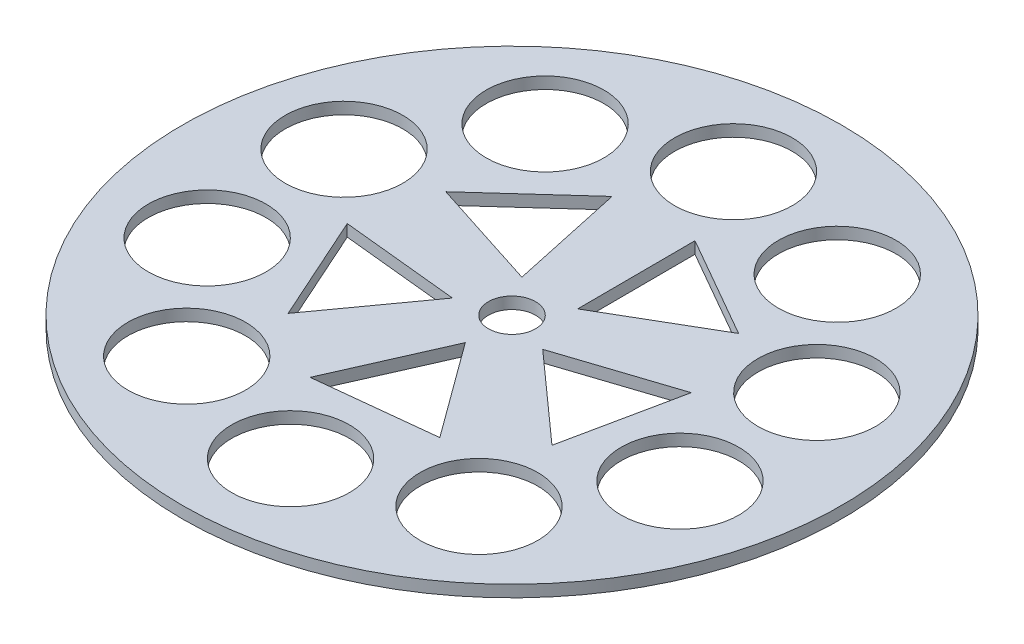
ISO-10303-21;
HEADER;
FILE_DESCRIPTION(('STEP AP214'),'2;1');
FILE_NAME('part.step','',(''),(''),'','','');
FILE_SCHEMA(('AUTOMOTIVE_DESIGN { 1 0 10303 214 1 1 1 1 }'));
ENDSEC;
DATA;
#1=APPLICATION_CONTEXT('core data for automotive mechanical design processes');
#2=APPLICATION_PROTOCOL_DEFINITION('international standard','automotive_design',2000,#1);
#3=PRODUCT_CONTEXT('',#1,'mechanical');
#4=PRODUCT('Part','Part','',(#3));
#5=PRODUCT_RELATED_PRODUCT_CATEGORY('part','',(#4));
#6=PRODUCT_DEFINITION_FORMATION('','',#4);
#7=PRODUCT_DEFINITION_CONTEXT('part definition',#1,'design');
#8=PRODUCT_DEFINITION('design','',#6,#7);
#9=PRODUCT_DEFINITION_SHAPE('','',#8);
#10=(LENGTH_UNIT() NAMED_UNIT(*) SI_UNIT(.MILLI.,.METRE.));
#11=(NAMED_UNIT(*) PLANE_ANGLE_UNIT() SI_UNIT($,.RADIAN.));
#12=(NAMED_UNIT(*) SI_UNIT($,.STERADIAN.) SOLID_ANGLE_UNIT());
#13=UNCERTAINTY_MEASURE_WITH_UNIT(LENGTH_MEASURE(1.E-05),#10,'distance_accuracy_value','');
#14=(GEOMETRIC_REPRESENTATION_CONTEXT(3) GLOBAL_UNCERTAINTY_ASSIGNED_CONTEXT((#13)) GLOBAL_UNIT_ASSIGNED_CONTEXT((#10,
#11,#12)) REPRESENTATION_CONTEXT('',''));
#15=CARTESIAN_POINT('',(0.,0.,0.));
#16=DIRECTION('',(0.,0.,1.));
#17=DIRECTION('',(1.,0.,0.));
#18=AXIS2_PLACEMENT_3D('',#15,#16,#17);
#19=CARTESIAN_POINT('',(0.,6.35,0.));
#20=DIRECTION('',(0.,1.,0.));
#21=DIRECTION('',(0.,0.,1.));
#22=AXIS2_PLACEMENT_3D('',#19,#20,#21);
#23=PLANE('',#22);
#24=CARTESIAN_POINT('',(-118.323617254643,6.35,46.135903586855));
#25=DIRECTION('',(0.,1.,0.));
#26=DIRECTION('',(0.,0.,1.));
#27=AXIS2_PLACEMENT_3D('',#24,#25,#26);
#28=CIRCLE('',#27,31.7500000000029);
#29=CARTESIAN_POINT('',(-118.323617254643,6.35,77.8859035868579));
#30=VERTEX_POINT('',#29);
#31=EDGE_CURVE('E269',#30,#30,#28,.T.);
#32=ORIENTED_EDGE('',*,*,#31,.F.);
#33=EDGE_LOOP('',(#32));
#34=FACE_BOUND('',#33,.T.);
#35=CARTESIAN_POINT('',(7.31384317384814,6.35,126.789225480825));
#36=DIRECTION('',(0.,1.,0.));
#37=DIRECTION('',(0.,0.,1.));
#38=AXIS2_PLACEMENT_3D('',#35,#36,#37);
#39=CIRCLE('',#38,31.7500000000088);
#40=CARTESIAN_POINT('',(7.31384317384814,6.35,158.539225480834));
#41=VERTEX_POINT('',#40);
#42=EDGE_CURVE('E281',#41,#41,#39,.T.);
#43=ORIENTED_EDGE('',*,*,#42,.F.);
#44=EDGE_LOOP('',(#43));
#45=FACE_BOUND('',#44,.T.);
#46=CARTESIAN_POINT('',(122.843820924473,6.35,32.2241471675647));
#47=DIRECTION('',(0.,1.,0.));
#48=DIRECTION('',(0.,0.,1.));
#49=AXIS2_PLACEMENT_3D('',#46,#47,#48);
#50=CIRCLE('',#49,31.7500000000108);
#51=CARTESIAN_POINT('',(122.843820924473,6.35,63.9741471675755));
#52=VERTEX_POINT('',#51);
#53=EDGE_CURVE('E293',#52,#52,#50,.T.);
#54=ORIENTED_EDGE('',*,*,#53,.F.);
#55=EDGE_LOOP('',(#54));
#56=FACE_BOUND('',#55,.T.);
#57=CARTESIAN_POINT('',(68.6078134653874,6.35,-106.873607272796));
#58=DIRECTION('',(0.,1.,0.));
#59=DIRECTION('',(0.,0.,1.));
#60=AXIS2_PLACEMENT_3D('',#57,#58,#59);
#61=CIRCLE('',#60,31.7500000000057);
#62=CARTESIAN_POINT('',(68.6078134653874,6.35,-75.1236072727907));
#63=VERTEX_POINT('',#62);
#64=EDGE_CURVE('E305',#63,#63,#61,.T.);
#65=ORIENTED_EDGE('',*,*,#64,.F.);
#66=EDGE_LOOP('',(#65));
#67=FACE_BOUND('',#66,.T.);
#68=CARTESIAN_POINT('',(0.,6.35,0.));
#69=DIRECTION('',(0.,1.,0.));
#70=DIRECTION('',(0.,0.,1.));
#71=AXIS2_PLACEMENT_3D('',#68,#69,#70);
#72=CIRCLE('',#71,12.7);
#73=CARTESIAN_POINT('',(0.,6.35,12.7));
#74=VERTEX_POINT('',#73);
#75=EDGE_CURVE('E317',#74,#74,#72,.T.);
#76=ORIENTED_EDGE('',*,*,#75,.F.);
#77=EDGE_LOOP('',(#76));
#78=FACE_BOUND('',#77,.T.);
#79=CARTESIAN_POINT('',(0.,6.35,0.));
#80=DIRECTION('',(0.,1.,0.));
#81=DIRECTION('',(0.,0.,1.));
#82=AXIS2_PLACEMENT_3D('',#79,#80,#81);
#83=CIRCLE('',#82,177.8);
#84=CARTESIAN_POINT('',(0.,6.35,177.8));
#85=VERTEX_POINT('',#84);
#86=EDGE_CURVE('E11',#85,#85,#83,.T.);
#87=ORIENTED_EDGE('',*,*,#86,.T.);
#88=EDGE_LOOP('',(#87));
#89=FACE_BOUND('',#88,.T.);
#90=CARTESIAN_POINT('',(-80.441860309045,6.35,-98.2756689624654));
#91=DIRECTION('',(0.,1.,0.));
#92=DIRECTION('',(0.,0.,1.));
#93=AXIS2_PLACEMENT_3D('',#90,#91,#92);
#94=CIRCLE('',#93,31.75);
#95=CARTESIAN_POINT('',(-80.441860309045,6.35,-66.5256689624654));
#96=VERTEX_POINT('',#95);
#97=EDGE_CURVE('E323',#96,#96,#94,.T.);
#98=ORIENTED_EDGE('',*,*,#97,.F.);
#99=EDGE_LOOP('',(#98));
#100=FACE_BOUND('',#99,.T.);
#101=CARTESIAN_POINT('',(-7.31384317383845,6.35,-126.789225480829));
#102=DIRECTION('',(0.,1.,0.));
#103=DIRECTION('',(0.,0.,1.));
#104=AXIS2_PLACEMENT_3D('',#101,#102,#103);
#105=CIRCLE('',#104,31.75);
#106=CARTESIAN_POINT('',(-7.31384317383845,6.35,-95.039225480829));
#107=VERTEX_POINT('',#106);
#108=EDGE_CURVE('E311',#107,#107,#105,.T.);
#109=ORIENTED_EDGE('',*,*,#108,.F.);
#110=EDGE_LOOP('',(#109));
#111=FACE_BOUND('',#110,.T.);
#112=CARTESIAN_POINT('',(118.323617254651,6.35,-46.1359035868617));
#113=DIRECTION('',(0.,1.,0.));
#114=DIRECTION('',(0.,0.,1.));
#115=AXIS2_PLACEMENT_3D('',#112,#113,#114);
#116=CIRCLE('',#115,31.7500000000089);
#117=CARTESIAN_POINT('',(118.323617254651,6.35,-14.3859035868528));
#118=VERTEX_POINT('',#117);
#119=EDGE_CURVE('E299',#118,#118,#116,.T.);
#120=ORIENTED_EDGE('',*,*,#119,.F.);
#121=EDGE_LOOP('',(#120));
#122=FACE_BOUND('',#121,.T.);
#123=CARTESIAN_POINT('',(80.4418603090533,6.35,98.2756689624587));
#124=DIRECTION('',(0.,1.,0.));
#125=DIRECTION('',(0.,0.,1.));
#126=AXIS2_PLACEMENT_3D('',#123,#124,#125);
#127=CIRCLE('',#126,31.7500000000108);
#128=CARTESIAN_POINT('',(80.4418603090533,6.35,130.025668962469));
#129=VERTEX_POINT('',#128);
#130=EDGE_CURVE('E287',#129,#129,#127,.T.);
#131=ORIENTED_EDGE('',*,*,#130,.F.);
#132=EDGE_LOOP('',(#131));
#133=FACE_BOUND('',#132,.T.);
#134=CARTESIAN_POINT('',(-68.607813465379,6.35,106.87360727279));
#135=DIRECTION('',(0.,1.,0.));
#136=DIRECTION('',(0.,0.,1.));
#137=AXIS2_PLACEMENT_3D('',#134,#135,#136);
#138=CIRCLE('',#137,31.7500000000057);
#139=CARTESIAN_POINT('',(-68.607813465379,6.35,138.623607272795));
#140=VERTEX_POINT('',#139);
#141=EDGE_CURVE('E275',#140,#140,#138,.T.);
#142=ORIENTED_EDGE('',*,*,#141,.F.);
#143=EDGE_LOOP('',(#142));
#144=FACE_BOUND('',#143,.T.);
#145=CARTESIAN_POINT('',(-122.843820924465,6.35,-32.2241471675714));
#146=DIRECTION('',(0.,1.,0.));
#147=DIRECTION('',(0.,0.,1.));
#148=AXIS2_PLACEMENT_3D('',#145,#146,#147);
#149=CIRCLE('',#148,31.7500000000013);
#150=CARTESIAN_POINT('',(-122.843820924465,6.35,-0.474147167570056));
#151=VERTEX_POINT('',#150);
#152=EDGE_CURVE('E263',#151,#151,#149,.T.);
#153=ORIENTED_EDGE('',*,*,#152,.F.);
#154=EDGE_LOOP('',(#153));
#155=FACE_BOUND('',#154,.T.);
#156=DIRECTION('',(0.00335438666040697,0.,0.999994374029241));
#157=VECTOR('',#156,1.);
#158=CARTESIAN_POINT('',(14.5502550947402,6.35,-84.1686096844464));
#159=LINE('',#158,#157);
#160=CARTESIAN_POINT('',(14.5502550947402,6.35,-84.1686096844464));
#161=VERTEX_POINT('',#160);
#162=CARTESIAN_POINT('',(14.7632586476761,6.35,-20.6689669335895));
#163=VERTEX_POINT('',#162);
#164=EDGE_CURVE('E241',#161,#163,#159,.T.);
#165=ORIENTED_EDGE('',*,*,#164,.F.);
#166=DIRECTION('',(-0.867697724881044,0.,-0.497092202952592));
#167=VECTOR('',#166,1.);
#168=CARTESIAN_POINT('',(69.6490606246866,6.35,-52.6032547969568));
#169=LINE('',#168,#167);
#170=CARTESIAN_POINT('',(69.6490606246866,6.35,-52.6032547969568));
#171=VERTEX_POINT('',#170);
#172=EDGE_CURVE('E239',#171,#161,#169,.T.);
#173=ORIENTED_EDGE('',*,*,#172,.F.);
#174=DIRECTION('',(0.864343338220637,0.,-0.502902171076648));
#175=VECTOR('',#174,1.);
#176=CARTESIAN_POINT('',(14.7632586476761,6.35,-20.6689669335895));
#177=LINE('',#176,#175);
#178=EDGE_CURVE('E245',#163,#171,#177,.T.);
#179=ORIENTED_EDGE('',*,*,#178,.F.);
#180=EDGE_LOOP('',(#165,#173,#179));
#181=FACE_BOUND('',#180,.T.);
#182=DIRECTION('',(-0.950014603195232,0.,0.312205467145927));
#183=VECTOR('',#182,1.);
#184=CARTESIAN_POINT('',(84.5453808046649,6.35,-12.1714158637978));
#185=LINE('',#184,#183);
#186=CARTESIAN_POINT('',(84.5453808046649,6.35,-12.1714158637978));
#187=VERTEX_POINT('',#186);
#188=CARTESIAN_POINT('',(24.2194535017676,6.35,7.65363129996857));
#189=VERTEX_POINT('',#188);
#190=EDGE_CURVE('E217',#187,#189,#185,.T.);
#191=ORIENTED_EDGE('',*,*,#190,.F.);
#192=DIRECTION('',(0.204629435848855,0.,-0.978839513906227));
#193=VECTOR('',#192,1.);
#194=CARTESIAN_POINT('',(71.5514116282625,6.35,49.9848932692477));
#195=LINE('',#194,#193);
#196=CARTESIAN_POINT('',(71.5514116282625,6.35,49.9848932692477));
#197=VERTEX_POINT('',#196);
#198=EDGE_CURVE('E215',#197,#187,#195,.T.);
#199=ORIENTED_EDGE('',*,*,#198,.F.);
#200=DIRECTION('',(0.745385167346376,0.,0.666634046760301));
#201=VECTOR('',#200,1.);
#202=CARTESIAN_POINT('',(24.2194535017676,6.35,7.65363129996857));
#203=LINE('',#202,#201);
#204=EDGE_CURVE('E221',#189,#197,#203,.T.);
#205=ORIENTED_EDGE('',*,*,#204,.F.);
#206=EDGE_LOOP('',(#191,#199,#205));
#207=FACE_BOUND('',#206,.T.);
#208=DIRECTION('',(-0.590495701243805,0.,-0.807040783859519));
#209=VECTOR('',#208,1.);
#210=CARTESIAN_POINT('',(37.7016638343494,6.35,76.6462609894119));
#211=LINE('',#210,#209);
#212=CARTESIAN_POINT('',(37.7016638343494,6.35,76.6462609894119));
#213=VERTEX_POINT('',#212);
#214=CARTESIAN_POINT('',(0.205186805367743,6.35,25.3991712143323));
#215=VERTEX_POINT('',#214);
#216=EDGE_CURVE('E193',#213,#215,#211,.T.);
#217=ORIENTED_EDGE('',*,*,#216,.F.);
#218=DIRECTION('',(0.994165671334353,0.,-0.107863886172882));
#219=VECTOR('',#218,1.);
#220=CARTESIAN_POINT('',(-25.4278562953821,6.35,83.4956177613899));
#221=LINE('',#220,#219);
#222=CARTESIAN_POINT('',(-25.4278562953821,6.35,83.4956177613899));
#223=VERTEX_POINT('',#222);
#224=EDGE_CURVE('E191',#223,#213,#221,.T.);
#225=ORIENTED_EDGE('',*,*,#224,.F.);
#226=DIRECTION('',(-0.403669970090548,0.,0.914904670032401));
#227=VECTOR('',#226,1.);
#228=CARTESIAN_POINT('',(0.205186805367741,6.35,25.3991712143323));
#229=LINE('',#228,#227);
#230=EDGE_CURVE('E197',#215,#223,#229,.T.);
#231=ORIENTED_EDGE('',*,*,#230,.F.);
#232=EDGE_LOOP('',(#217,#225,#231));
#233=FACE_BOUND('',#232,.T.);
#234=DIRECTION('',(0.585068189615857,0.,-0.810984101878467));
#235=VECTOR('',#234,1.);
#236=CARTESIAN_POINT('',(-61.2444711226105,6.35,59.5414102658517));
#237=LINE('',#236,#235);
#238=CARTESIAN_POINT('',(-61.2444711226105,6.35,59.5414102658517));
#239=VERTEX_POINT('',#238);
#240=CARTESIAN_POINT('',(-24.0926410820035,6.35,8.04391979656893));
#241=VERTEX_POINT('',#240);
#242=EDGE_CURVE('E169',#239,#241,#237,.T.);
#243=ORIENTED_EDGE('',*,*,#242,.F.);
#244=DIRECTION('',(0.409798739484131,0.,0.912175966092736));
#245=VECTOR('',#244,1.);
#246=CARTESIAN_POINT('',(-87.2666910798529,6.35,1.61823641896279));
#247=LINE('',#246,#245);
#248=CARTESIAN_POINT('',(-87.2666910798529,6.35,1.61823641896279));
#249=VERTEX_POINT('',#248);
#250=EDGE_CURVE('E167',#249,#239,#247,.T.);
#251=ORIENTED_EDGE('',*,*,#250,.F.);
#252=DIRECTION('',(-0.994866929099988,0.,-0.10119186421427));
#253=VECTOR('',#252,1.);
#254=CARTESIAN_POINT('',(-24.0926410820035,6.35,8.04391979656893));
#255=LINE('',#254,#253);
#256=EDGE_CURVE('E173',#241,#249,#255,.T.);
#257=ORIENTED_EDGE('',*,*,#256,.F.);
#258=EDGE_LOOP('',(#243,#251,#257));
#259=FACE_BOUND('',#258,.T.);
#260=DIRECTION('',(0.952087728162773,0.,0.305825044562819));
#261=VECTOR('',#260,1.);
#262=CARTESIAN_POINT('',(-75.5528286111303,6.35,-39.8476457070115));
#263=LINE('',#262,#261);
#264=CARTESIAN_POINT('',(-75.5528286111303,6.35,-39.8476457070115));
#265=VERTEX_POINT('',#264);
#266=CARTESIAN_POINT('',(-15.0952578727942,6.35,-20.4277553772724));
#267=VERTEX_POINT('',#266);
#268=EDGE_CURVE('E148',#265,#267,#263,.T.);
#269=ORIENTED_EDGE('',*,*,#268,.F.);
#270=DIRECTION('',(-0.740896121786295,0.,0.671619636938965));
#271=VECTOR('',#270,1.);
#272=CARTESIAN_POINT('',(-28.5059248777005,6.35,-82.4954926526358));
#273=LINE('',#272,#271);
#274=CARTESIAN_POINT('',(-28.5059248777005,6.35,-82.4954926526358));
#275=VERTEX_POINT('',#274);
#276=EDGE_CURVE('E140',#275,#265,#273,.T.);
#277=ORIENTED_EDGE('',*,*,#276,.F.);
#278=DIRECTION('',(-0.211191606376477,0.,-0.977444681501784));
#279=VECTOR('',#278,1.);
#280=CARTESIAN_POINT('',(-15.0952578727942,6.35,-20.4277553772724));
#281=LINE('',#280,#279);
#282=EDGE_CURVE('E157',#267,#275,#281,.T.);
#283=ORIENTED_EDGE('',*,*,#282,.F.);
#284=EDGE_LOOP('',(#269,#277,#283));
#285=FACE_BOUND('',#284,.T.);
#286=ADVANCED_FACE('F33',(#34,#45,#56,#67,#78,#89,#100,#111,#122,#133,#144,#155,#181,#207,#233,
#259,#285),#23,.T.);
#287=CARTESIAN_POINT('',(0.,0.,0.));
#288=DIRECTION('',(0.,1.,0.));
#289=DIRECTION('',(0.,0.,1.));
#290=AXIS2_PLACEMENT_3D('',#287,#288,#289);
#291=PLANE('',#290);
#292=DIRECTION('',(0.409798739484131,0.,0.912175966092736));
#293=VECTOR('',#292,1.);
#294=CARTESIAN_POINT('',(-87.2666910798529,0.,1.61823641896279));
#295=LINE('',#294,#293);
#296=CARTESIAN_POINT('',(-87.2666910798529,0.,1.61823641896278));
#297=VERTEX_POINT('',#296);
#298=CARTESIAN_POINT('',(-61.2444711226105,0.,59.5414102658517));
#299=VERTEX_POINT('',#298);
#300=EDGE_CURVE('E155',#297,#299,#295,.T.);
#301=ORIENTED_EDGE('',*,*,#300,.T.);
#302=DIRECTION('',(0.585068189615857,0.,-0.810984101878467));
#303=VECTOR('',#302,1.);
#304=CARTESIAN_POINT('',(-61.2444711226105,0.,59.5414102658517));
#305=LINE('',#304,#303);
#306=CARTESIAN_POINT('',(-24.0926410820035,0.,8.04391979656893));
#307=VERTEX_POINT('',#306);
#308=EDGE_CURVE('E178',#299,#307,#305,.T.);
#309=ORIENTED_EDGE('',*,*,#308,.T.);
#310=DIRECTION('',(-0.994866929099988,0.,-0.10119186421427));
#311=VECTOR('',#310,1.);
#312=CARTESIAN_POINT('',(-24.0926410820035,0.,8.04391979656893));
#313=LINE('',#312,#311);
#314=EDGE_CURVE('E170',#307,#297,#313,.T.);
#315=ORIENTED_EDGE('',*,*,#314,.T.);
#316=EDGE_LOOP('',(#301,#309,#315));
#317=FACE_BOUND('',#316,.T.);
#318=DIRECTION('',(0.204629435848855,0.,-0.978839513906227));
#319=VECTOR('',#318,1.);
#320=CARTESIAN_POINT('',(71.5514116282625,0.,49.9848932692477));
#321=LINE('',#320,#319);
#322=CARTESIAN_POINT('',(71.5514116282625,0.,49.9848932692477));
#323=VERTEX_POINT('',#322);
#324=CARTESIAN_POINT('',(84.5453808046649,0.,-12.1714158637978));
#325=VERTEX_POINT('',#324);
#326=EDGE_CURVE('E214',#323,#325,#321,.T.);
#327=ORIENTED_EDGE('',*,*,#326,.T.);
#328=DIRECTION('',(-0.950014603195232,0.,0.312205467145927));
#329=VECTOR('',#328,1.);
#330=CARTESIAN_POINT('',(84.5453808046649,0.,-12.1714158637978));
#331=LINE('',#330,#329);
#332=CARTESIAN_POINT('',(24.2194535017676,0.,7.65363129996857));
#333=VERTEX_POINT('',#332);
#334=EDGE_CURVE('E226',#325,#333,#331,.T.);
#335=ORIENTED_EDGE('',*,*,#334,.T.);
#336=DIRECTION('',(0.745385167346376,0.,0.666634046760301));
#337=VECTOR('',#336,1.);
#338=CARTESIAN_POINT('',(24.2194535017676,0.,7.65363129996857));
#339=LINE('',#338,#337);
#340=EDGE_CURVE('E218',#333,#323,#339,.T.);
#341=ORIENTED_EDGE('',*,*,#340,.T.);
#342=EDGE_LOOP('',(#327,#335,#341));
#343=FACE_BOUND('',#342,.T.);
#344=CARTESIAN_POINT('',(-122.843820924465,0.,-32.2241471675714));
#345=DIRECTION('',(0.,1.,0.));
#346=DIRECTION('',(0.,0.,1.));
#347=AXIS2_PLACEMENT_3D('',#344,#345,#346);
#348=CIRCLE('',#347,31.7500000000013);
#349=CARTESIAN_POINT('',(-122.843820924465,0.,-0.474147167570056));
#350=VERTEX_POINT('',#349);
#351=EDGE_CURVE('E262',#350,#350,#348,.T.);
#352=ORIENTED_EDGE('',*,*,#351,.T.);
#353=EDGE_LOOP('',(#352));
#354=FACE_BOUND('',#353,.T.);
#355=CARTESIAN_POINT('',(-118.323617254643,0.,46.135903586855));
#356=DIRECTION('',(0.,1.,0.));
#357=DIRECTION('',(0.,0.,1.));
#358=AXIS2_PLACEMENT_3D('',#355,#356,#357);
#359=CIRCLE('',#358,31.7500000000029);
#360=CARTESIAN_POINT('',(-118.323617254643,0.,77.8859035868579));
#361=VERTEX_POINT('',#360);
#362=EDGE_CURVE('E266',#361,#361,#359,.T.);
#363=ORIENTED_EDGE('',*,*,#362,.T.);
#364=EDGE_LOOP('',(#363));
#365=FACE_BOUND('',#364,.T.);
#366=CARTESIAN_POINT('',(-68.607813465379,0.,106.87360727279));
#367=DIRECTION('',(0.,1.,0.));
#368=DIRECTION('',(0.,0.,1.));
#369=AXIS2_PLACEMENT_3D('',#366,#367,#368);
#370=CIRCLE('',#369,31.7500000000057);
#371=CARTESIAN_POINT('',(-68.607813465379,0.,138.623607272795));
#372=VERTEX_POINT('',#371);
#373=EDGE_CURVE('E272',#372,#372,#370,.T.);
#374=ORIENTED_EDGE('',*,*,#373,.T.);
#375=EDGE_LOOP('',(#374));
#376=FACE_BOUND('',#375,.T.);
#377=CARTESIAN_POINT('',(7.31384317384814,0.,126.789225480825));
#378=DIRECTION('',(0.,1.,0.));
#379=DIRECTION('',(0.,0.,1.));
#380=AXIS2_PLACEMENT_3D('',#377,#378,#379);
#381=CIRCLE('',#380,31.7500000000088);
#382=CARTESIAN_POINT('',(7.31384317384814,0.,158.539225480834));
#383=VERTEX_POINT('',#382);
#384=EDGE_CURVE('E278',#383,#383,#381,.T.);
#385=ORIENTED_EDGE('',*,*,#384,.T.);
#386=EDGE_LOOP('',(#385));
#387=FACE_BOUND('',#386,.T.);
#388=CARTESIAN_POINT('',(80.4418603090533,0.,98.2756689624587));
#389=DIRECTION('',(0.,1.,0.));
#390=DIRECTION('',(0.,0.,1.));
#391=AXIS2_PLACEMENT_3D('',#388,#389,#390);
#392=CIRCLE('',#391,31.7500000000108);
#393=CARTESIAN_POINT('',(80.4418603090533,0.,130.025668962469));
#394=VERTEX_POINT('',#393);
#395=EDGE_CURVE('E284',#394,#394,#392,.T.);
#396=ORIENTED_EDGE('',*,*,#395,.T.);
#397=EDGE_LOOP('',(#396));
#398=FACE_BOUND('',#397,.T.);
#399=CARTESIAN_POINT('',(122.843820924473,0.,32.2241471675647));
#400=DIRECTION('',(0.,1.,0.));
#401=DIRECTION('',(0.,0.,1.));
#402=AXIS2_PLACEMENT_3D('',#399,#400,#401);
#403=CIRCLE('',#402,31.7500000000108);
#404=CARTESIAN_POINT('',(122.843820924473,0.,63.9741471675755));
#405=VERTEX_POINT('',#404);
#406=EDGE_CURVE('E290',#405,#405,#403,.T.);
#407=ORIENTED_EDGE('',*,*,#406,.T.);
#408=EDGE_LOOP('',(#407));
#409=FACE_BOUND('',#408,.T.);
#410=CARTESIAN_POINT('',(118.323617254651,0.,-46.1359035868617));
#411=DIRECTION('',(0.,1.,0.));
#412=DIRECTION('',(0.,0.,1.));
#413=AXIS2_PLACEMENT_3D('',#410,#411,#412);
#414=CIRCLE('',#413,31.7500000000089);
#415=CARTESIAN_POINT('',(118.323617254651,0.,-14.3859035868528));
#416=VERTEX_POINT('',#415);
#417=EDGE_CURVE('E296',#416,#416,#414,.T.);
#418=ORIENTED_EDGE('',*,*,#417,.T.);
#419=EDGE_LOOP('',(#418));
#420=FACE_BOUND('',#419,.T.);
#421=CARTESIAN_POINT('',(68.6078134653874,0.,-106.873607272796));
#422=DIRECTION('',(0.,1.,0.));
#423=DIRECTION('',(0.,0.,1.));
#424=AXIS2_PLACEMENT_3D('',#421,#422,#423);
#425=CIRCLE('',#424,31.7500000000057);
#426=CARTESIAN_POINT('',(68.6078134653874,0.,-75.1236072727907));
#427=VERTEX_POINT('',#426);
#428=EDGE_CURVE('E302',#427,#427,#425,.T.);
#429=ORIENTED_EDGE('',*,*,#428,.T.);
#430=EDGE_LOOP('',(#429));
#431=FACE_BOUND('',#430,.T.);
#432=CARTESIAN_POINT('',(-7.31384317383845,0.,-126.789225480829));
#433=DIRECTION('',(0.,1.,0.));
#434=DIRECTION('',(0.,0.,1.));
#435=AXIS2_PLACEMENT_3D('',#432,#433,#434);
#436=CIRCLE('',#435,31.75);
#437=CARTESIAN_POINT('',(-7.31384317383845,0.,-95.039225480829));
#438=VERTEX_POINT('',#437);
#439=EDGE_CURVE('E308',#438,#438,#436,.T.);
#440=ORIENTED_EDGE('',*,*,#439,.T.);
#441=EDGE_LOOP('',(#440));
#442=FACE_BOUND('',#441,.T.);
#443=CARTESIAN_POINT('',(0.,0.,0.));
#444=DIRECTION('',(0.,1.,0.));
#445=DIRECTION('',(0.,0.,1.));
#446=AXIS2_PLACEMENT_3D('',#443,#444,#445);
#447=CIRCLE('',#446,12.7);
#448=CARTESIAN_POINT('',(0.,0.,12.7));
#449=VERTEX_POINT('',#448);
#450=EDGE_CURVE('E314',#449,#449,#447,.T.);
#451=ORIENTED_EDGE('',*,*,#450,.T.);
#452=EDGE_LOOP('',(#451));
#453=FACE_BOUND('',#452,.T.);
#454=CARTESIAN_POINT('',(-80.441860309045,0.,-98.2756689624654));
#455=DIRECTION('',(0.,1.,0.));
#456=DIRECTION('',(0.,0.,1.));
#457=AXIS2_PLACEMENT_3D('',#454,#455,#456);
#458=CIRCLE('',#457,31.75);
#459=CARTESIAN_POINT('',(-80.441860309045,0.,-66.5256689624654));
#460=VERTEX_POINT('',#459);
#461=EDGE_CURVE('E320',#460,#460,#458,.T.);
#462=ORIENTED_EDGE('',*,*,#461,.T.);
#463=EDGE_LOOP('',(#462));
#464=FACE_BOUND('',#463,.T.);
#465=CARTESIAN_POINT('',(0.,0.,0.));
#466=DIRECTION('',(0.,1.,0.));
#467=DIRECTION('',(0.,0.,1.));
#468=AXIS2_PLACEMENT_3D('',#465,#466,#467);
#469=CIRCLE('',#468,177.8);
#470=CARTESIAN_POINT('',(0.,0.,177.8));
#471=VERTEX_POINT('',#470);
#472=EDGE_CURVE('E37',#471,#471,#469,.T.);
#473=ORIENTED_EDGE('',*,*,#472,.F.);
#474=EDGE_LOOP('',(#473));
#475=FACE_BOUND('',#474,.T.);
#476=DIRECTION('',(-0.867697724881044,0.,-0.497092202952592));
#477=VECTOR('',#476,1.);
#478=CARTESIAN_POINT('',(69.6490606246866,0.,-52.6032547969568));
#479=LINE('',#478,#477);
#480=CARTESIAN_POINT('',(69.6490606246866,0.,-52.6032547969568));
#481=VERTEX_POINT('',#480);
#482=CARTESIAN_POINT('',(14.5502550947402,0.,-84.1686096844464));
#483=VERTEX_POINT('',#482);
#484=EDGE_CURVE('E238',#481,#483,#479,.T.);
#485=ORIENTED_EDGE('',*,*,#484,.T.);
#486=DIRECTION('',(0.00335438666040697,0.,0.999994374029241));
#487=VECTOR('',#486,1.);
#488=CARTESIAN_POINT('',(14.5502550947402,0.,-84.1686096844464));
#489=LINE('',#488,#487);
#490=CARTESIAN_POINT('',(14.7632586476761,0.,-20.6689669335895));
#491=VERTEX_POINT('',#490);
#492=EDGE_CURVE('E250',#483,#491,#489,.T.);
#493=ORIENTED_EDGE('',*,*,#492,.T.);
#494=DIRECTION('',(0.864343338220637,0.,-0.502902171076648));
#495=VECTOR('',#494,1.);
#496=CARTESIAN_POINT('',(14.7632586476761,0.,-20.6689669335895));
#497=LINE('',#496,#495);
#498=EDGE_CURVE('E242',#491,#481,#497,.T.);
#499=ORIENTED_EDGE('',*,*,#498,.T.);
#500=EDGE_LOOP('',(#485,#493,#499));
#501=FACE_BOUND('',#500,.T.);
#502=DIRECTION('',(0.994165671334353,0.,-0.107863886172882));
#503=VECTOR('',#502,1.);
#504=CARTESIAN_POINT('',(-25.4278562953821,0.,83.4956177613899));
#505=LINE('',#504,#503);
#506=CARTESIAN_POINT('',(-25.4278562953821,0.,83.4956177613899));
#507=VERTEX_POINT('',#506);
#508=CARTESIAN_POINT('',(37.7016638343494,0.,76.6462609894119));
#509=VERTEX_POINT('',#508);
#510=EDGE_CURVE('E190',#507,#509,#505,.T.);
#511=ORIENTED_EDGE('',*,*,#510,.T.);
#512=DIRECTION('',(-0.590495701243805,0.,-0.807040783859519));
#513=VECTOR('',#512,1.);
#514=CARTESIAN_POINT('',(37.7016638343494,0.,76.6462609894119));
#515=LINE('',#514,#513);
#516=CARTESIAN_POINT('',(0.205186805367741,0.,25.3991712143323));
#517=VERTEX_POINT('',#516);
#518=EDGE_CURVE('E202',#509,#517,#515,.T.);
#519=ORIENTED_EDGE('',*,*,#518,.T.);
#520=DIRECTION('',(-0.403669970090548,0.,0.914904670032401));
#521=VECTOR('',#520,1.);
#522=CARTESIAN_POINT('',(0.205186805367741,0.,25.3991712143323));
#523=LINE('',#522,#521);
#524=EDGE_CURVE('E194',#517,#507,#523,.T.);
#525=ORIENTED_EDGE('',*,*,#524,.T.);
#526=EDGE_LOOP('',(#511,#519,#525));
#527=FACE_BOUND('',#526,.T.);
#528=DIRECTION('',(-0.740896121786295,0.,0.671619636938965));
#529=VECTOR('',#528,1.);
#530=CARTESIAN_POINT('',(-28.5059248777005,0.,-82.4954926526358));
#531=LINE('',#530,#529);
#532=CARTESIAN_POINT('',(-28.5059248777005,0.,-82.4954926526358));
#533=VERTEX_POINT('',#532);
#534=CARTESIAN_POINT('',(-75.5528286111303,0.,-39.8476457070115));
#535=VERTEX_POINT('',#534);
#536=EDGE_CURVE('E56',#533,#535,#531,.T.);
#537=ORIENTED_EDGE('',*,*,#536,.T.);
#538=DIRECTION('',(0.952087728162773,0.,0.305825044562819));
#539=VECTOR('',#538,1.);
#540=CARTESIAN_POINT('',(-75.5528286111303,0.,-39.8476457070115));
#541=LINE('',#540,#539);
#542=CARTESIAN_POINT('',(-15.0952578727942,0.,-20.4277553772724));
#543=VERTEX_POINT('',#542);
#544=EDGE_CURVE('E154',#535,#543,#541,.T.);
#545=ORIENTED_EDGE('',*,*,#544,.T.);
#546=DIRECTION('',(-0.211191606376477,0.,-0.977444681501784));
#547=VECTOR('',#546,1.);
#548=CARTESIAN_POINT('',(-15.0952578727942,0.,-20.4277553772724));
#549=LINE('',#548,#547);
#550=EDGE_CURVE('E149',#543,#533,#549,.T.);
#551=ORIENTED_EDGE('',*,*,#550,.T.);
#552=EDGE_LOOP('',(#537,#545,#551));
#553=FACE_BOUND('',#552,.T.);
#554=ADVANCED_FACE('F329',(#317,#343,#354,#365,#376,#387,#398,#409,#420,#431,#442,#453,#464,
#475,#501,#527,#553),#291,.F.);
#555=CARTESIAN_POINT('',(0.,6.35,0.));
#556=DIRECTION('',(0.,-1.,0.));
#557=DIRECTION('',(0.,0.,-1.));
#558=AXIS2_PLACEMENT_3D('',#555,#556,#557);
#559=CYLINDRICAL_SURFACE('',#558,177.8);
#560=ORIENTED_EDGE('',*,*,#86,.F.);
#561=EDGE_LOOP('',(#560));
#562=FACE_BOUND('',#561,.T.);
#563=ORIENTED_EDGE('',*,*,#472,.T.);
#564=EDGE_LOOP('',(#563));
#565=FACE_BOUND('',#564,.T.);
#566=ADVANCED_FACE('F35',(#562,#565),#559,.T.);
#567=CARTESIAN_POINT('',(-80.441860309045,6.35,-98.2756689624654));
#568=DIRECTION('',(0.,-1.,0.));
#569=DIRECTION('',(0.,0.,-1.));
#570=AXIS2_PLACEMENT_3D('',#567,#568,#569);
#571=CYLINDRICAL_SURFACE('',#570,31.75);
#572=ORIENTED_EDGE('',*,*,#97,.T.);
#573=EDGE_LOOP('',(#572));
#574=FACE_BOUND('',#573,.T.);
#575=ORIENTED_EDGE('',*,*,#461,.F.);
#576=EDGE_LOOP('',(#575));
#577=FACE_BOUND('',#576,.T.);
#578=ADVANCED_FACE('F332',(#574,#577),#571,.F.);
#579=CARTESIAN_POINT('',(0.,6.35,0.));
#580=DIRECTION('',(0.,-1.,0.));
#581=DIRECTION('',(0.,0.,-1.));
#582=AXIS2_PLACEMENT_3D('',#579,#580,#581);
#583=CYLINDRICAL_SURFACE('',#582,12.7);
#584=ORIENTED_EDGE('',*,*,#75,.T.);
#585=EDGE_LOOP('',(#584));
#586=FACE_BOUND('',#585,.T.);
#587=ORIENTED_EDGE('',*,*,#450,.F.);
#588=EDGE_LOOP('',(#587));
#589=FACE_BOUND('',#588,.T.);
#590=ADVANCED_FACE('F334',(#586,#589),#583,.F.);
#591=CARTESIAN_POINT('',(-7.31384317383845,6.35,-126.789225480829));
#592=DIRECTION('',(0.,-1.,0.));
#593=DIRECTION('',(0.,0.,-1.));
#594=AXIS2_PLACEMENT_3D('',#591,#592,#593);
#595=CYLINDRICAL_SURFACE('',#594,31.75);
#596=ORIENTED_EDGE('',*,*,#108,.T.);
#597=EDGE_LOOP('',(#596));
#598=FACE_BOUND('',#597,.T.);
#599=ORIENTED_EDGE('',*,*,#439,.F.);
#600=EDGE_LOOP('',(#599));
#601=FACE_BOUND('',#600,.T.);
#602=ADVANCED_FACE('F341',(#598,#601),#595,.F.);
#603=CARTESIAN_POINT('',(68.6078134653874,6.35,-106.873607272796));
#604=DIRECTION('',(0.,-1.,0.));
#605=DIRECTION('',(0.,0.,-1.));
#606=AXIS2_PLACEMENT_3D('',#603,#604,#605);
#607=CYLINDRICAL_SURFACE('',#606,31.7500000000057);
#608=ORIENTED_EDGE('',*,*,#64,.T.);
#609=EDGE_LOOP('',(#608));
#610=FACE_BOUND('',#609,.T.);
#611=ORIENTED_EDGE('',*,*,#428,.F.);
#612=EDGE_LOOP('',(#611));
#613=FACE_BOUND('',#612,.T.);
#614=ADVANCED_FACE('F476',(#610,#613),#607,.F.);
#615=CARTESIAN_POINT('',(118.323617254651,6.35,-46.1359035868617));
#616=DIRECTION('',(0.,-1.,0.));
#617=DIRECTION('',(0.,0.,-1.));
#618=AXIS2_PLACEMENT_3D('',#615,#616,#617);
#619=CYLINDRICAL_SURFACE('',#618,31.7500000000089);
#620=ORIENTED_EDGE('',*,*,#119,.T.);
#621=EDGE_LOOP('',(#620));
#622=FACE_BOUND('',#621,.T.);
#623=ORIENTED_EDGE('',*,*,#417,.F.);
#624=EDGE_LOOP('',(#623));
#625=FACE_BOUND('',#624,.T.);
#626=ADVANCED_FACE('F472',(#622,#625),#619,.F.);
#627=CARTESIAN_POINT('',(122.843820924473,6.35,32.2241471675647));
#628=DIRECTION('',(0.,-1.,0.));
#629=DIRECTION('',(0.,0.,-1.));
#630=AXIS2_PLACEMENT_3D('',#627,#628,#629);
#631=CYLINDRICAL_SURFACE('',#630,31.7500000000108);
#632=ORIENTED_EDGE('',*,*,#53,.T.);
#633=EDGE_LOOP('',(#632));
#634=FACE_BOUND('',#633,.T.);
#635=ORIENTED_EDGE('',*,*,#406,.F.);
#636=EDGE_LOOP('',(#635));
#637=FACE_BOUND('',#636,.T.);
#638=ADVANCED_FACE('F468',(#634,#637),#631,.F.);
#639=CARTESIAN_POINT('',(80.4418603090533,6.35,98.2756689624587));
#640=DIRECTION('',(0.,-1.,0.));
#641=DIRECTION('',(0.,0.,-1.));
#642=AXIS2_PLACEMENT_3D('',#639,#640,#641);
#643=CYLINDRICAL_SURFACE('',#642,31.7500000000108);
#644=ORIENTED_EDGE('',*,*,#130,.T.);
#645=EDGE_LOOP('',(#644));
#646=FACE_BOUND('',#645,.T.);
#647=ORIENTED_EDGE('',*,*,#395,.F.);
#648=EDGE_LOOP('',(#647));
#649=FACE_BOUND('',#648,.T.);
#650=ADVANCED_FACE('F464',(#646,#649),#643,.F.);
#651=CARTESIAN_POINT('',(7.31384317384814,6.35,126.789225480825));
#652=DIRECTION('',(0.,-1.,0.));
#653=DIRECTION('',(0.,0.,-1.));
#654=AXIS2_PLACEMENT_3D('',#651,#652,#653);
#655=CYLINDRICAL_SURFACE('',#654,31.7500000000088);
#656=ORIENTED_EDGE('',*,*,#42,.T.);
#657=EDGE_LOOP('',(#656));
#658=FACE_BOUND('',#657,.T.);
#659=ORIENTED_EDGE('',*,*,#384,.F.);
#660=EDGE_LOOP('',(#659));
#661=FACE_BOUND('',#660,.T.);
#662=ADVANCED_FACE('F460',(#658,#661),#655,.F.);
#663=CARTESIAN_POINT('',(-68.607813465379,6.35,106.87360727279));
#664=DIRECTION('',(0.,-1.,0.));
#665=DIRECTION('',(0.,0.,-1.));
#666=AXIS2_PLACEMENT_3D('',#663,#664,#665);
#667=CYLINDRICAL_SURFACE('',#666,31.7500000000057);
#668=ORIENTED_EDGE('',*,*,#141,.T.);
#669=EDGE_LOOP('',(#668));
#670=FACE_BOUND('',#669,.T.);
#671=ORIENTED_EDGE('',*,*,#373,.F.);
#672=EDGE_LOOP('',(#671));
#673=FACE_BOUND('',#672,.T.);
#674=ADVANCED_FACE('F456',(#670,#673),#667,.F.);
#675=CARTESIAN_POINT('',(-118.323617254643,6.35,46.135903586855));
#676=DIRECTION('',(0.,-1.,0.));
#677=DIRECTION('',(0.,0.,-1.));
#678=AXIS2_PLACEMENT_3D('',#675,#676,#677);
#679=CYLINDRICAL_SURFACE('',#678,31.7500000000029);
#680=ORIENTED_EDGE('',*,*,#31,.T.);
#681=EDGE_LOOP('',(#680));
#682=FACE_BOUND('',#681,.T.);
#683=ORIENTED_EDGE('',*,*,#362,.F.);
#684=EDGE_LOOP('',(#683));
#685=FACE_BOUND('',#684,.T.);
#686=ADVANCED_FACE('F452',(#682,#685),#679,.F.);
#687=CARTESIAN_POINT('',(-122.843820924465,6.35,-32.2241471675714));
#688=DIRECTION('',(0.,-1.,0.));
#689=DIRECTION('',(0.,0.,-1.));
#690=AXIS2_PLACEMENT_3D('',#687,#688,#689);
#691=CYLINDRICAL_SURFACE('',#690,31.7500000000013);
#692=ORIENTED_EDGE('',*,*,#152,.T.);
#693=EDGE_LOOP('',(#692));
#694=FACE_BOUND('',#693,.T.);
#695=ORIENTED_EDGE('',*,*,#351,.F.);
#696=EDGE_LOOP('',(#695));
#697=FACE_BOUND('',#696,.T.);
#698=ADVANCED_FACE('F448',(#694,#697),#691,.F.);
#699=CARTESIAN_POINT('',(69.6490606246866,6.35,-52.6032547969568));
#700=DIRECTION('',(-0.497092202952592,0.,0.867697724881044));
#701=DIRECTION('',(0.867697724881044,0.,0.497092202952592));
#702=AXIS2_PLACEMENT_3D('',#699,#700,#701);
#703=PLANE('',#702);
#704=ORIENTED_EDGE('',*,*,#484,.F.);
#705=DIRECTION('',(0.,-1.,0.));
#706=VECTOR('',#705,1.);
#707=CARTESIAN_POINT('',(69.6490606246866,6.35,-52.6032547969568));
#708=LINE('',#707,#706);
#709=EDGE_CURVE('E247',#171,#481,#708,.T.);
#710=ORIENTED_EDGE('',*,*,#709,.F.);
#711=ORIENTED_EDGE('',*,*,#172,.T.);
#712=DIRECTION('',(0.,-1.,0.));
#713=VECTOR('',#712,1.);
#714=CARTESIAN_POINT('',(14.5502550947402,6.35,-84.1686096844464));
#715=LINE('',#714,#713);
#716=EDGE_CURVE('E259',#161,#483,#715,.T.);
#717=ORIENTED_EDGE('',*,*,#716,.T.);
#718=EDGE_LOOP('',(#704,#710,#711,#717));
#719=FACE_BOUND('',#718,.T.);
#720=ADVANCED_FACE('F444',(#719),#703,.T.);
#721=CARTESIAN_POINT('',(14.5502550947402,6.35,-84.1686096844464));
#722=DIRECTION('',(0.99999437402924,0.,-0.00335438666040697));
#723=DIRECTION('',(-0.00335438666040697,0.,-0.999994374029241));
#724=AXIS2_PLACEMENT_3D('',#721,#722,#723);
#725=PLANE('',#724);
#726=ORIENTED_EDGE('',*,*,#492,.F.);
#727=ORIENTED_EDGE('',*,*,#716,.F.);
#728=ORIENTED_EDGE('',*,*,#164,.T.);
#729=DIRECTION('',(0.,-1.,0.));
#730=VECTOR('',#729,1.);
#731=CARTESIAN_POINT('',(14.7632586476761,6.35,-20.6689669335895));
#732=LINE('',#731,#730);
#733=EDGE_CURVE('E257',#163,#491,#732,.T.);
#734=ORIENTED_EDGE('',*,*,#733,.T.);
#735=EDGE_LOOP('',(#726,#727,#728,#734));
#736=FACE_BOUND('',#735,.T.);
#737=ADVANCED_FACE('F440',(#736),#725,.T.);
#738=CARTESIAN_POINT('',(14.7632586476761,6.35,-20.6689669335895));
#739=DIRECTION('',(-0.502902171076648,0.,-0.864343338220637));
#740=DIRECTION('',(-0.864343338220637,0.,0.502902171076648));
#741=AXIS2_PLACEMENT_3D('',#738,#739,#740);
#742=PLANE('',#741);
#743=ORIENTED_EDGE('',*,*,#498,.F.);
#744=ORIENTED_EDGE('',*,*,#733,.F.);
#745=ORIENTED_EDGE('',*,*,#178,.T.);
#746=ORIENTED_EDGE('',*,*,#709,.T.);
#747=EDGE_LOOP('',(#743,#744,#745,#746));
#748=FACE_BOUND('',#747,.T.);
#749=ADVANCED_FACE('F436',(#748),#742,.T.);
#750=CARTESIAN_POINT('',(71.5514116282625,6.35,49.9848932692477));
#751=DIRECTION('',(-0.978839513906227,0.,-0.204629435848855));
#752=DIRECTION('',(-0.204629435848855,0.,0.978839513906227));
#753=AXIS2_PLACEMENT_3D('',#750,#751,#752);
#754=PLANE('',#753);
#755=ORIENTED_EDGE('',*,*,#326,.F.);
#756=DIRECTION('',(0.,-1.,0.));
#757=VECTOR('',#756,1.);
#758=CARTESIAN_POINT('',(71.5514116282625,6.35,49.9848932692477));
#759=LINE('',#758,#757);
#760=EDGE_CURVE('E223',#197,#323,#759,.T.);
#761=ORIENTED_EDGE('',*,*,#760,.F.);
#762=ORIENTED_EDGE('',*,*,#198,.T.);
#763=DIRECTION('',(0.,-1.,0.));
#764=VECTOR('',#763,1.);
#765=CARTESIAN_POINT('',(84.5453808046649,6.35,-12.1714158637978));
#766=LINE('',#765,#764);
#767=EDGE_CURVE('E235',#187,#325,#766,.T.);
#768=ORIENTED_EDGE('',*,*,#767,.T.);
#769=EDGE_LOOP('',(#755,#761,#762,#768));
#770=FACE_BOUND('',#769,.T.);
#771=ADVANCED_FACE('F432',(#770),#754,.T.);
#772=CARTESIAN_POINT('',(84.5453808046649,6.35,-12.1714158637978));
#773=DIRECTION('',(0.312205467145927,0.,0.950014603195232));
#774=DIRECTION('',(0.950014603195232,0.,-0.312205467145927));
#775=AXIS2_PLACEMENT_3D('',#772,#773,#774);
#776=PLANE('',#775);
#777=ORIENTED_EDGE('',*,*,#334,.F.);
#778=ORIENTED_EDGE('',*,*,#767,.F.);
#779=ORIENTED_EDGE('',*,*,#190,.T.);
#780=DIRECTION('',(0.,-1.,0.));
#781=VECTOR('',#780,1.);
#782=CARTESIAN_POINT('',(24.2194535017676,6.35,7.65363129996857));
#783=LINE('',#782,#781);
#784=EDGE_CURVE('E233',#189,#333,#783,.T.);
#785=ORIENTED_EDGE('',*,*,#784,.T.);
#786=EDGE_LOOP('',(#777,#778,#779,#785));
#787=FACE_BOUND('',#786,.T.);
#788=ADVANCED_FACE('F428',(#787),#776,.T.);
#789=CARTESIAN_POINT('',(24.2194535017676,6.35,7.65363129996857));
#790=DIRECTION('',(0.666634046760301,0.,-0.745385167346376));
#791=DIRECTION('',(-0.745385167346376,0.,-0.666634046760301));
#792=AXIS2_PLACEMENT_3D('',#789,#790,#791);
#793=PLANE('',#792);
#794=ORIENTED_EDGE('',*,*,#340,.F.);
#795=ORIENTED_EDGE('',*,*,#784,.F.);
#796=ORIENTED_EDGE('',*,*,#204,.T.);
#797=ORIENTED_EDGE('',*,*,#760,.T.);
#798=EDGE_LOOP('',(#794,#795,#796,#797));
#799=FACE_BOUND('',#798,.T.);
#800=ADVANCED_FACE('F424',(#799),#793,.T.);
#801=CARTESIAN_POINT('',(-25.4278562953821,6.35,83.4956177613899));
#802=DIRECTION('',(-0.107863886172882,0.,-0.994165671334352));
#803=DIRECTION('',(-0.994165671334353,0.,0.107863886172882));
#804=AXIS2_PLACEMENT_3D('',#801,#802,#803);
#805=PLANE('',#804);
#806=ORIENTED_EDGE('',*,*,#510,.F.);
#807=DIRECTION('',(0.,-1.,0.));
#808=VECTOR('',#807,1.);
#809=CARTESIAN_POINT('',(-25.4278562953821,6.35,83.4956177613899));
#810=LINE('',#809,#808);
#811=EDGE_CURVE('E199',#223,#507,#810,.T.);
#812=ORIENTED_EDGE('',*,*,#811,.F.);
#813=ORIENTED_EDGE('',*,*,#224,.T.);
#814=DIRECTION('',(0.,-1.,0.));
#815=VECTOR('',#814,1.);
#816=CARTESIAN_POINT('',(37.7016638343494,6.35,76.6462609894119));
#817=LINE('',#816,#815);
#818=EDGE_CURVE('E211',#213,#509,#817,.T.);
#819=ORIENTED_EDGE('',*,*,#818,.T.);
#820=EDGE_LOOP('',(#806,#812,#813,#819));
#821=FACE_BOUND('',#820,.T.);
#822=ADVANCED_FACE('F420',(#821),#805,.T.);
#823=CARTESIAN_POINT('',(37.7016638343494,6.35,76.6462609894119));
#824=DIRECTION('',(-0.807040783859519,0.,0.590495701243805));
#825=DIRECTION('',(0.590495701243805,0.,0.807040783859519));
#826=AXIS2_PLACEMENT_3D('',#823,#824,#825);
#827=PLANE('',#826);
#828=ORIENTED_EDGE('',*,*,#518,.F.);
#829=ORIENTED_EDGE('',*,*,#818,.F.);
#830=ORIENTED_EDGE('',*,*,#216,.T.);
#831=DIRECTION('',(0.,-1.,0.));
#832=VECTOR('',#831,1.);
#833=CARTESIAN_POINT('',(0.205186805367741,6.35,25.3991712143323));
#834=LINE('',#833,#832);
#835=EDGE_CURVE('E209',#215,#517,#834,.T.);
#836=ORIENTED_EDGE('',*,*,#835,.T.);
#837=EDGE_LOOP('',(#828,#829,#830,#836));
#838=FACE_BOUND('',#837,.T.);
#839=ADVANCED_FACE('F416',(#838),#827,.T.);
#840=CARTESIAN_POINT('',(0.205186805367741,6.35,25.3991712143323));
#841=DIRECTION('',(0.914904670032401,0.,0.403669970090548));
#842=DIRECTION('',(0.403669970090548,0.,-0.914904670032401));
#843=AXIS2_PLACEMENT_3D('',#840,#841,#842);
#844=PLANE('',#843);
#845=ORIENTED_EDGE('',*,*,#524,.F.);
#846=ORIENTED_EDGE('',*,*,#835,.F.);
#847=ORIENTED_EDGE('',*,*,#230,.T.);
#848=ORIENTED_EDGE('',*,*,#811,.T.);
#849=EDGE_LOOP('',(#845,#846,#847,#848));
#850=FACE_BOUND('',#849,.T.);
#851=ADVANCED_FACE('F413',(#850),#844,.T.);
#852=CARTESIAN_POINT('',(-87.2666910798529,6.35,1.61823641896279));
#853=DIRECTION('',(0.912175966092736,0.,-0.409798739484131));
#854=DIRECTION('',(-0.409798739484131,0.,-0.912175966092737));
#855=AXIS2_PLACEMENT_3D('',#852,#853,#854);
#856=PLANE('',#855);
#857=ORIENTED_EDGE('',*,*,#300,.F.);
#858=DIRECTION('',(0.,-1.,0.));
#859=VECTOR('',#858,1.);
#860=CARTESIAN_POINT('',(-87.2666910798529,6.35,1.61823641896279));
#861=LINE('',#860,#859);
#862=EDGE_CURVE('E175',#249,#297,#861,.T.);
#863=ORIENTED_EDGE('',*,*,#862,.F.);
#864=ORIENTED_EDGE('',*,*,#250,.T.);
#865=DIRECTION('',(0.,-1.,0.));
#866=VECTOR('',#865,1.);
#867=CARTESIAN_POINT('',(-61.2444711226105,6.35,59.5414102658517));
#868=LINE('',#867,#866);
#869=EDGE_CURVE('E187',#239,#299,#868,.T.);
#870=ORIENTED_EDGE('',*,*,#869,.T.);
#871=EDGE_LOOP('',(#857,#863,#864,#870));
#872=FACE_BOUND('',#871,.T.);
#873=ADVANCED_FACE('F396',(#872),#856,.T.);
#874=CARTESIAN_POINT('',(-61.2444711226105,6.35,59.5414102658517));
#875=DIRECTION('',(-0.810984101878467,0.,-0.585068189615857));
#876=DIRECTION('',(-0.585068189615857,0.,0.810984101878467));
#877=AXIS2_PLACEMENT_3D('',#874,#875,#876);
#878=PLANE('',#877);
#879=ORIENTED_EDGE('',*,*,#308,.F.);
#880=ORIENTED_EDGE('',*,*,#869,.F.);
#881=ORIENTED_EDGE('',*,*,#242,.T.);
#882=DIRECTION('',(0.,-1.,0.));
#883=VECTOR('',#882,1.);
#884=CARTESIAN_POINT('',(-24.0926410820035,6.35,8.04391979656893));
#885=LINE('',#884,#883);
#886=EDGE_CURVE('E185',#241,#307,#885,.T.);
#887=ORIENTED_EDGE('',*,*,#886,.T.);
#888=EDGE_LOOP('',(#879,#880,#881,#887));
#889=FACE_BOUND('',#888,.T.);
#890=ADVANCED_FACE('F393',(#889),#878,.T.);
#891=CARTESIAN_POINT('',(-24.0926410820035,6.35,8.04391979656893));
#892=DIRECTION('',(-0.10119186421427,0.,0.994866929099988));
#893=DIRECTION('',(0.994866929099988,0.,0.10119186421427));
#894=AXIS2_PLACEMENT_3D('',#891,#892,#893);
#895=PLANE('',#894);
#896=ORIENTED_EDGE('',*,*,#314,.F.);
#897=ORIENTED_EDGE('',*,*,#886,.F.);
#898=ORIENTED_EDGE('',*,*,#256,.T.);
#899=ORIENTED_EDGE('',*,*,#862,.T.);
#900=EDGE_LOOP('',(#896,#897,#898,#899));
#901=FACE_BOUND('',#900,.T.);
#902=ADVANCED_FACE('F400',(#901),#895,.T.);
#903=CARTESIAN_POINT('',(-28.5059248777005,6.35,-82.4954926526358));
#904=DIRECTION('',(0.671619636938965,0.,0.740896121786295));
#905=DIRECTION('',(0.740896121786295,0.,-0.671619636938965));
#906=AXIS2_PLACEMENT_3D('',#903,#904,#905);
#907=PLANE('',#906);
#908=ORIENTED_EDGE('',*,*,#536,.F.);
#909=DIRECTION('',(0.,-1.,0.));
#910=VECTOR('',#909,1.);
#911=CARTESIAN_POINT('',(-28.5059248777005,6.35,-82.4954926526358));
#912=LINE('',#911,#910);
#913=EDGE_CURVE('E144',#275,#533,#912,.T.);
#914=ORIENTED_EDGE('',*,*,#913,.F.);
#915=ORIENTED_EDGE('',*,*,#276,.T.);
#916=DIRECTION('',(0.,-1.,0.));
#917=VECTOR('',#916,1.);
#918=CARTESIAN_POINT('',(-75.5528286111303,6.35,-39.8476457070115));
#919=LINE('',#918,#917);
#920=EDGE_CURVE('E143',#265,#535,#919,.T.);
#921=ORIENTED_EDGE('',*,*,#920,.T.);
#922=EDGE_LOOP('',(#908,#914,#915,#921));
#923=FACE_BOUND('',#922,.T.);
#924=ADVANCED_FACE('F142',(#923),#907,.T.);
#925=CARTESIAN_POINT('',(-75.5528286111303,6.35,-39.8476457070115));
#926=DIRECTION('',(0.305825044562819,0.,-0.952087728162773));
#927=DIRECTION('',(-0.952087728162773,0.,-0.305825044562819));
#928=AXIS2_PLACEMENT_3D('',#925,#926,#927);
#929=PLANE('',#928);
#930=ORIENTED_EDGE('',*,*,#544,.F.);
#931=ORIENTED_EDGE('',*,*,#920,.F.);
#932=ORIENTED_EDGE('',*,*,#268,.T.);
#933=DIRECTION('',(0.,-1.,0.));
#934=VECTOR('',#933,1.);
#935=CARTESIAN_POINT('',(-15.0952578727942,6.35,-20.4277553772724));
#936=LINE('',#935,#934);
#937=EDGE_CURVE('E48',#267,#543,#936,.T.);
#938=ORIENTED_EDGE('',*,*,#937,.T.);
#939=EDGE_LOOP('',(#930,#931,#932,#938));
#940=FACE_BOUND('',#939,.T.);
#941=ADVANCED_FACE('F152',(#940),#929,.T.);
#942=CARTESIAN_POINT('',(-15.0952578727942,6.35,-20.4277553772724));
#943=DIRECTION('',(-0.977444681501784,0.,0.211191606376477));
#944=DIRECTION('',(0.211191606376477,0.,0.977444681501784));
#945=AXIS2_PLACEMENT_3D('',#942,#943,#944);
#946=PLANE('',#945);
#947=ORIENTED_EDGE('',*,*,#550,.F.);
#948=ORIENTED_EDGE('',*,*,#937,.F.);
#949=ORIENTED_EDGE('',*,*,#282,.T.);
#950=ORIENTED_EDGE('',*,*,#913,.T.);
#951=EDGE_LOOP('',(#947,#948,#949,#950));
#952=FACE_BOUND('',#951,.T.);
#953=ADVANCED_FACE('F588',(#952),#946,.T.);
#954=CLOSED_SHELL('',(#286,#554,#566,#578,#590,#602,#614,#626,#638,#650,#662,#674,#686,#698,
#720,#737,#749,#771,#788,#800,#822,#839,#851,#873,#890,#902,#924,#941,#953));
#955=MANIFOLD_SOLID_BREP('B2',#954);
#956=ADVANCED_BREP_SHAPE_REPRESENTATION('',(#18,#955),#14);
#957=SHAPE_DEFINITION_REPRESENTATION(#9,#956);
ENDSEC;
END-ISO-10303-21;
